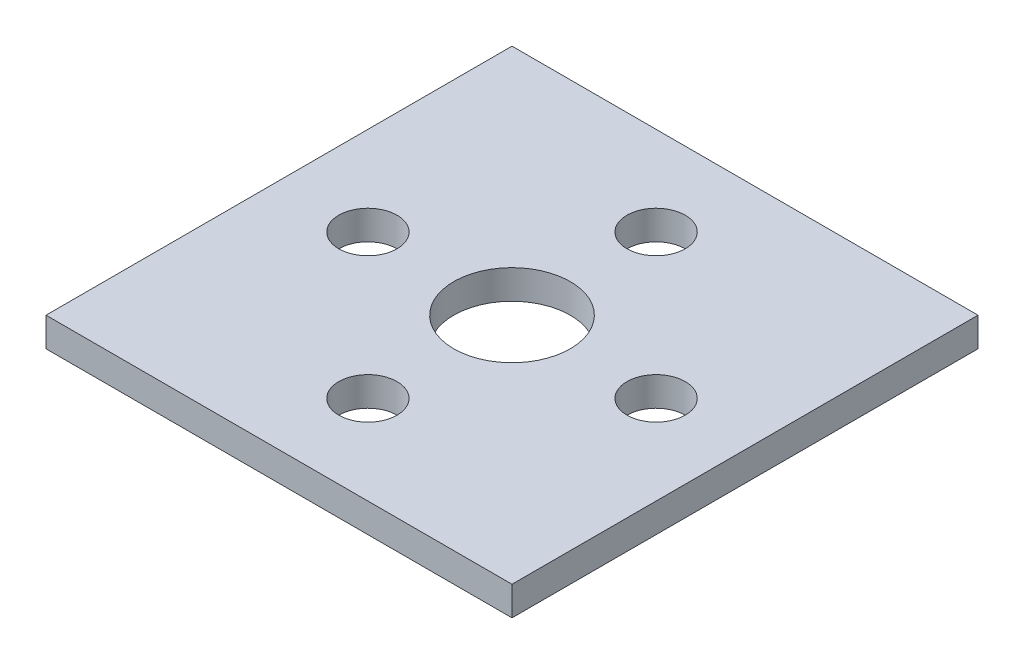
ISO-10303-21;
HEADER;
FILE_DESCRIPTION(('STEP AP214'),'2;1');
FILE_NAME('part.step','',(''),(''),'','','');
FILE_SCHEMA(('AUTOMOTIVE_DESIGN { 1 0 10303 214 1 1 1 1 }'));
ENDSEC;
DATA;
#1=APPLICATION_CONTEXT('core data for automotive mechanical design processes');
#2=APPLICATION_PROTOCOL_DEFINITION('international standard','automotive_design',2000,#1);
#3=PRODUCT_CONTEXT('',#1,'mechanical');
#4=PRODUCT('Part','Part','',(#3));
#5=PRODUCT_RELATED_PRODUCT_CATEGORY('part','',(#4));
#6=PRODUCT_DEFINITION_FORMATION('','',#4);
#7=PRODUCT_DEFINITION_CONTEXT('part definition',#1,'design');
#8=PRODUCT_DEFINITION('design','',#6,#7);
#9=PRODUCT_DEFINITION_SHAPE('','',#8);
#10=(LENGTH_UNIT() NAMED_UNIT(*) SI_UNIT(.MILLI.,.METRE.));
#11=(NAMED_UNIT(*) PLANE_ANGLE_UNIT() SI_UNIT($,.RADIAN.));
#12=(NAMED_UNIT(*) SI_UNIT($,.STERADIAN.) SOLID_ANGLE_UNIT());
#13=UNCERTAINTY_MEASURE_WITH_UNIT(LENGTH_MEASURE(1.E-05),#10,'distance_accuracy_value','');
#14=(GEOMETRIC_REPRESENTATION_CONTEXT(3) GLOBAL_UNCERTAINTY_ASSIGNED_CONTEXT((#13)) GLOBAL_UNIT_ASSIGNED_CONTEXT((#10,
#11,#12)) REPRESENTATION_CONTEXT('',''));
#15=CARTESIAN_POINT('',(0.,0.,0.));
#16=DIRECTION('',(0.,0.,1.));
#17=DIRECTION('',(1.,0.,0.));
#18=AXIS2_PLACEMENT_3D('',#15,#16,#17);
#19=CARTESIAN_POINT('',(0.,3.175,0.));
#20=DIRECTION('',(0.,-1.,0.));
#21=DIRECTION('',(0.,0.,-1.));
#22=AXIS2_PLACEMENT_3D('',#19,#20,#21);
#23=PLANE('',#22);
#24=DIRECTION('',(0.,0.,1.));
#25=VECTOR('',#24,1.);
#26=CARTESIAN_POINT('',(0.,3.175,0.));
#27=LINE('',#26,#25);
#28=CARTESIAN_POINT('',(0.,3.175,-50.8));
#29=VERTEX_POINT('',#28);
#30=CARTESIAN_POINT('',(0.,3.175,0.));
#31=VERTEX_POINT('',#30);
#32=EDGE_CURVE('E85',#29,#31,#27,.T.);
#33=ORIENTED_EDGE('',*,*,#32,.T.);
#34=DIRECTION('',(1.,0.,0.));
#35=VECTOR('',#34,1.);
#36=CARTESIAN_POINT('',(0.,3.175,0.));
#37=LINE('',#36,#35);
#38=CARTESIAN_POINT('',(50.8,3.175,0.));
#39=VERTEX_POINT('',#38);
#40=EDGE_CURVE('E80',#31,#39,#37,.T.);
#41=ORIENTED_EDGE('',*,*,#40,.T.);
#42=DIRECTION('',(0.,0.,-1.));
#43=VECTOR('',#42,1.);
#44=CARTESIAN_POINT('',(50.8,3.175,0.));
#45=LINE('',#44,#43);
#46=CARTESIAN_POINT('',(50.8,3.175,-50.8));
#47=VERTEX_POINT('',#46);
#48=EDGE_CURVE('E83',#39,#47,#45,.T.);
#49=ORIENTED_EDGE('',*,*,#48,.T.);
#50=DIRECTION('',(-1.,0.,0.));
#51=VECTOR('',#50,1.);
#52=CARTESIAN_POINT('',(0.,3.175,-50.8));
#53=LINE('',#52,#51);
#54=EDGE_CURVE('E50',#47,#29,#53,.T.);
#55=ORIENTED_EDGE('',*,*,#54,.T.);
#56=EDGE_LOOP('',(#33,#41,#49,#55));
#57=FACE_BOUND('',#56,.T.);
#58=CARTESIAN_POINT('',(25.4,3.175,-25.4));
#59=DIRECTION('',(0.,1.,0.));
#60=DIRECTION('',(0.,0.,1.));
#61=AXIS2_PLACEMENT_3D('',#58,#59,#60);
#62=CIRCLE('',#61,6.35);
#63=CARTESIAN_POINT('',(25.4,3.175,-19.05));
#64=VERTEX_POINT('',#63);
#65=EDGE_CURVE('E100',#64,#64,#62,.T.);
#66=ORIENTED_EDGE('',*,*,#65,.F.);
#67=EDGE_LOOP('',(#66));
#68=FACE_BOUND('',#67,.T.);
#69=CARTESIAN_POINT('',(25.4,3.175,-41.1092369477912));
#70=DIRECTION('',(0.,1.,0.));
#71=DIRECTION('',(0.,0.,1.));
#72=AXIS2_PLACEMENT_3D('',#69,#70,#71);
#73=CIRCLE('',#72,3.175);
#74=CARTESIAN_POINT('',(25.4,3.175,-37.9342369477912));
#75=VERTEX_POINT('',#74);
#76=EDGE_CURVE('E115',#75,#75,#73,.T.);
#77=ORIENTED_EDGE('',*,*,#76,.F.);
#78=EDGE_LOOP('',(#77));
#79=FACE_BOUND('',#78,.T.);
#80=CARTESIAN_POINT('',(41.1092369477914,3.175,-25.4000000000002));
#81=DIRECTION('',(0.,1.,0.));
#82=DIRECTION('',(0.,0.,1.));
#83=AXIS2_PLACEMENT_3D('',#80,#81,#82);
#84=CIRCLE('',#83,3.175);
#85=CARTESIAN_POINT('',(41.1092369477914,3.175,-22.2250000000002));
#86=VERTEX_POINT('',#85);
#87=EDGE_CURVE('E121',#86,#86,#84,.T.);
#88=ORIENTED_EDGE('',*,*,#87,.F.);
#89=EDGE_LOOP('',(#88));
#90=FACE_BOUND('',#89,.T.);
#91=CARTESIAN_POINT('',(25.4000000000003,3.175,-9.69076305220883));
#92=DIRECTION('',(0.,1.,0.));
#93=DIRECTION('',(0.,0.,1.));
#94=AXIS2_PLACEMENT_3D('',#91,#92,#93);
#95=CIRCLE('',#94,3.175);
#96=CARTESIAN_POINT('',(25.4000000000003,3.175,-6.51576305220883));
#97=VERTEX_POINT('',#96);
#98=EDGE_CURVE('E127',#97,#97,#95,.T.);
#99=ORIENTED_EDGE('',*,*,#98,.F.);
#100=EDGE_LOOP('',(#99));
#101=FACE_BOUND('',#100,.T.);
#102=CARTESIAN_POINT('',(9.69076305220906,3.175,-25.3999999999999));
#103=DIRECTION('',(0.,1.,0.));
#104=DIRECTION('',(0.,0.,1.));
#105=AXIS2_PLACEMENT_3D('',#102,#103,#104);
#106=CIRCLE('',#105,3.175);
#107=CARTESIAN_POINT('',(9.69076305220906,3.175,-22.2249999999999));
#108=VERTEX_POINT('',#107);
#109=EDGE_CURVE('E133',#108,#108,#106,.T.);
#110=ORIENTED_EDGE('',*,*,#109,.F.);
#111=EDGE_LOOP('',(#110));
#112=FACE_BOUND('',#111,.T.);
#113=ADVANCED_FACE('F33',(#57,#68,#79,#90,#101,#112),#23,.F.);
#114=CARTESIAN_POINT('',(0.,0.,0.));
#115=DIRECTION('',(0.,-1.,0.));
#116=DIRECTION('',(0.,0.,-1.));
#117=AXIS2_PLACEMENT_3D('',#114,#115,#116);
#118=PLANE('',#117);
#119=CARTESIAN_POINT('',(25.4000000000003,0.,-9.69076305220883));
#120=DIRECTION('',(0.,1.,0.));
#121=DIRECTION('',(0.,0.,1.));
#122=AXIS2_PLACEMENT_3D('',#119,#120,#121);
#123=CIRCLE('',#122,3.175);
#124=CARTESIAN_POINT('',(25.4000000000003,0.,-6.51576305220883));
#125=VERTEX_POINT('',#124);
#126=EDGE_CURVE('E130',#125,#125,#123,.T.);
#127=ORIENTED_EDGE('',*,*,#126,.T.);
#128=EDGE_LOOP('',(#127));
#129=FACE_BOUND('',#128,.T.);
#130=CARTESIAN_POINT('',(25.4,0.,-41.1092369477912));
#131=DIRECTION('',(0.,1.,0.));
#132=DIRECTION('',(0.,0.,1.));
#133=AXIS2_PLACEMENT_3D('',#130,#131,#132);
#134=CIRCLE('',#133,3.175);
#135=CARTESIAN_POINT('',(25.4,0.,-37.9342369477912));
#136=VERTEX_POINT('',#135);
#137=EDGE_CURVE('E118',#136,#136,#134,.T.);
#138=ORIENTED_EDGE('',*,*,#137,.T.);
#139=EDGE_LOOP('',(#138));
#140=FACE_BOUND('',#139,.T.);
#141=DIRECTION('',(0.,0.,1.));
#142=VECTOR('',#141,1.);
#143=CARTESIAN_POINT('',(0.,0.,0.));
#144=LINE('',#143,#142);
#145=CARTESIAN_POINT('',(0.,0.,-50.8));
#146=VERTEX_POINT('',#145);
#147=CARTESIAN_POINT('',(0.,0.,0.));
#148=VERTEX_POINT('',#147);
#149=EDGE_CURVE('E97',#146,#148,#144,.T.);
#150=ORIENTED_EDGE('',*,*,#149,.F.);
#151=DIRECTION('',(-1.,0.,0.));
#152=VECTOR('',#151,1.);
#153=CARTESIAN_POINT('',(0.,0.,-50.8));
#154=LINE('',#153,#152);
#155=CARTESIAN_POINT('',(50.8,0.,-50.8));
#156=VERTEX_POINT('',#155);
#157=EDGE_CURVE('E73',#156,#146,#154,.T.);
#158=ORIENTED_EDGE('',*,*,#157,.F.);
#159=DIRECTION('',(0.,0.,-1.));
#160=VECTOR('',#159,1.);
#161=CARTESIAN_POINT('',(50.8,0.,0.));
#162=LINE('',#161,#160);
#163=CARTESIAN_POINT('',(50.8,0.,0.));
#164=VERTEX_POINT('',#163);
#165=EDGE_CURVE('E67',#164,#156,#162,.T.);
#166=ORIENTED_EDGE('',*,*,#165,.F.);
#167=DIRECTION('',(1.,0.,0.));
#168=VECTOR('',#167,1.);
#169=CARTESIAN_POINT('',(0.,0.,0.));
#170=LINE('',#169,#168);
#171=EDGE_CURVE('E89',#148,#164,#170,.T.);
#172=ORIENTED_EDGE('',*,*,#171,.F.);
#173=EDGE_LOOP('',(#150,#158,#166,#172));
#174=FACE_BOUND('',#173,.T.);
#175=CARTESIAN_POINT('',(25.4,0.,-25.4));
#176=DIRECTION('',(0.,1.,0.));
#177=DIRECTION('',(0.,0.,1.));
#178=AXIS2_PLACEMENT_3D('',#175,#176,#177);
#179=CIRCLE('',#178,6.35);
#180=CARTESIAN_POINT('',(25.4,0.,-19.05));
#181=VERTEX_POINT('',#180);
#182=EDGE_CURVE('E112',#181,#181,#179,.T.);
#183=ORIENTED_EDGE('',*,*,#182,.T.);
#184=EDGE_LOOP('',(#183));
#185=FACE_BOUND('',#184,.T.);
#186=CARTESIAN_POINT('',(41.1092369477914,0.,-25.4000000000002));
#187=DIRECTION('',(0.,1.,0.));
#188=DIRECTION('',(0.,0.,1.));
#189=AXIS2_PLACEMENT_3D('',#186,#187,#188);
#190=CIRCLE('',#189,3.175);
#191=CARTESIAN_POINT('',(41.1092369477914,0.,-22.2250000000002));
#192=VERTEX_POINT('',#191);
#193=EDGE_CURVE('E124',#192,#192,#190,.T.);
#194=ORIENTED_EDGE('',*,*,#193,.T.);
#195=EDGE_LOOP('',(#194));
#196=FACE_BOUND('',#195,.T.);
#197=CARTESIAN_POINT('',(9.69076305220906,0.,-25.3999999999999));
#198=DIRECTION('',(0.,1.,0.));
#199=DIRECTION('',(0.,0.,1.));
#200=AXIS2_PLACEMENT_3D('',#197,#198,#199);
#201=CIRCLE('',#200,3.175);
#202=CARTESIAN_POINT('',(9.69076305220906,0.,-22.2249999999999));
#203=VERTEX_POINT('',#202);
#204=EDGE_CURVE('E136',#203,#203,#201,.T.);
#205=ORIENTED_EDGE('',*,*,#204,.T.);
#206=EDGE_LOOP('',(#205));
#207=FACE_BOUND('',#206,.T.);
#208=ADVANCED_FACE('F108',(#129,#140,#174,#185,#196,#207),#118,.T.);
#209=CARTESIAN_POINT('',(0.,3.175,0.));
#210=DIRECTION('',(1.,0.,0.));
#211=DIRECTION('',(0.,0.,-1.));
#212=AXIS2_PLACEMENT_3D('',#209,#210,#211);
#213=PLANE('',#212);
#214=ORIENTED_EDGE('',*,*,#149,.T.);
#215=DIRECTION('',(0.,-1.,0.));
#216=VECTOR('',#215,1.);
#217=CARTESIAN_POINT('',(0.,3.175,0.));
#218=LINE('',#217,#216);
#219=EDGE_CURVE('E11',#31,#148,#218,.T.);
#220=ORIENTED_EDGE('',*,*,#219,.F.);
#221=ORIENTED_EDGE('',*,*,#32,.F.);
#222=DIRECTION('',(0.,-1.,0.));
#223=VECTOR('',#222,1.);
#224=CARTESIAN_POINT('',(0.,3.175,-50.8));
#225=LINE('',#224,#223);
#226=EDGE_CURVE('E93',#29,#146,#225,.T.);
#227=ORIENTED_EDGE('',*,*,#226,.T.);
#228=EDGE_LOOP('',(#214,#220,#221,#227));
#229=FACE_BOUND('',#228,.T.);
#230=ADVANCED_FACE('F35',(#229),#213,.F.);
#231=CARTESIAN_POINT('',(0.,3.175,0.));
#232=DIRECTION('',(0.,0.,-1.));
#233=DIRECTION('',(-1.,0.,0.));
#234=AXIS2_PLACEMENT_3D('',#231,#232,#233);
#235=PLANE('',#234);
#236=ORIENTED_EDGE('',*,*,#171,.T.);
#237=DIRECTION('',(0.,-1.,0.));
#238=VECTOR('',#237,1.);
#239=CARTESIAN_POINT('',(50.8,3.175,0.));
#240=LINE('',#239,#238);
#241=EDGE_CURVE('E42',#39,#164,#240,.T.);
#242=ORIENTED_EDGE('',*,*,#241,.F.);
#243=ORIENTED_EDGE('',*,*,#40,.F.);
#244=ORIENTED_EDGE('',*,*,#219,.T.);
#245=EDGE_LOOP('',(#236,#242,#243,#244));
#246=FACE_BOUND('',#245,.T.);
#247=ADVANCED_FACE('F88',(#246),#235,.F.);
#248=CARTESIAN_POINT('',(50.8,3.175,0.));
#249=DIRECTION('',(-1.,0.,0.));
#250=DIRECTION('',(0.,0.,1.));
#251=AXIS2_PLACEMENT_3D('',#248,#249,#250);
#252=PLANE('',#251);
#253=ORIENTED_EDGE('',*,*,#165,.T.);
#254=DIRECTION('',(0.,-1.,0.));
#255=VECTOR('',#254,1.);
#256=CARTESIAN_POINT('',(50.8,3.175,-50.8));
#257=LINE('',#256,#255);
#258=EDGE_CURVE('E90',#47,#156,#257,.T.);
#259=ORIENTED_EDGE('',*,*,#258,.F.);
#260=ORIENTED_EDGE('',*,*,#48,.F.);
#261=ORIENTED_EDGE('',*,*,#241,.T.);
#262=EDGE_LOOP('',(#253,#259,#260,#261));
#263=FACE_BOUND('',#262,.T.);
#264=ADVANCED_FACE('F91',(#263),#252,.F.);
#265=CARTESIAN_POINT('',(0.,3.175,-50.8));
#266=DIRECTION('',(0.,0.,1.));
#267=DIRECTION('',(1.,0.,0.));
#268=AXIS2_PLACEMENT_3D('',#265,#266,#267);
#269=PLANE('',#268);
#270=ORIENTED_EDGE('',*,*,#157,.T.);
#271=ORIENTED_EDGE('',*,*,#226,.F.);
#272=ORIENTED_EDGE('',*,*,#54,.F.);
#273=ORIENTED_EDGE('',*,*,#258,.T.);
#274=EDGE_LOOP('',(#270,#271,#272,#273));
#275=FACE_BOUND('',#274,.T.);
#276=ADVANCED_FACE('F105',(#275),#269,.F.);
#277=CARTESIAN_POINT('',(25.4,3.175,-25.4));
#278=DIRECTION('',(0.,-1.,0.));
#279=DIRECTION('',(0.,0.,-1.));
#280=AXIS2_PLACEMENT_3D('',#277,#278,#279);
#281=CYLINDRICAL_SURFACE('',#280,6.35);
#282=ORIENTED_EDGE('',*,*,#65,.T.);
#283=EDGE_LOOP('',(#282));
#284=FACE_BOUND('',#283,.T.);
#285=ORIENTED_EDGE('',*,*,#182,.F.);
#286=EDGE_LOOP('',(#285));
#287=FACE_BOUND('',#286,.T.);
#288=ADVANCED_FACE('F153',(#284,#287),#281,.F.);
#289=CARTESIAN_POINT('',(25.4,3.175,-41.1092369477912));
#290=DIRECTION('',(0.,-1.,0.));
#291=DIRECTION('',(0.,0.,-1.));
#292=AXIS2_PLACEMENT_3D('',#289,#290,#291);
#293=CYLINDRICAL_SURFACE('',#292,3.175);
#294=ORIENTED_EDGE('',*,*,#76,.T.);
#295=EDGE_LOOP('',(#294));
#296=FACE_BOUND('',#295,.T.);
#297=ORIENTED_EDGE('',*,*,#137,.F.);
#298=EDGE_LOOP('',(#297));
#299=FACE_BOUND('',#298,.T.);
#300=ADVANCED_FACE('F199',(#296,#299),#293,.F.);
#301=CARTESIAN_POINT('',(41.1092369477914,3.175,-25.4000000000002));
#302=DIRECTION('',(0.,-1.,0.));
#303=DIRECTION('',(0.,0.,-1.));
#304=AXIS2_PLACEMENT_3D('',#301,#302,#303);
#305=CYLINDRICAL_SURFACE('',#304,3.175);
#306=ORIENTED_EDGE('',*,*,#87,.T.);
#307=EDGE_LOOP('',(#306));
#308=FACE_BOUND('',#307,.T.);
#309=ORIENTED_EDGE('',*,*,#193,.F.);
#310=EDGE_LOOP('',(#309));
#311=FACE_BOUND('',#310,.T.);
#312=ADVANCED_FACE('F207',(#308,#311),#305,.F.);
#313=CARTESIAN_POINT('',(25.4000000000003,3.175,-9.69076305220883));
#314=DIRECTION('',(0.,-1.,0.));
#315=DIRECTION('',(0.,0.,-1.));
#316=AXIS2_PLACEMENT_3D('',#313,#314,#315);
#317=CYLINDRICAL_SURFACE('',#316,3.175);
#318=ORIENTED_EDGE('',*,*,#98,.T.);
#319=EDGE_LOOP('',(#318));
#320=FACE_BOUND('',#319,.T.);
#321=ORIENTED_EDGE('',*,*,#126,.F.);
#322=EDGE_LOOP('',(#321));
#323=FACE_BOUND('',#322,.T.);
#324=ADVANCED_FACE('F215',(#320,#323),#317,.F.);
#325=CARTESIAN_POINT('',(9.69076305220906,3.175,-25.3999999999999));
#326=DIRECTION('',(0.,-1.,0.));
#327=DIRECTION('',(0.,0.,-1.));
#328=AXIS2_PLACEMENT_3D('',#325,#326,#327);
#329=CYLINDRICAL_SURFACE('',#328,3.175);
#330=ORIENTED_EDGE('',*,*,#109,.T.);
#331=EDGE_LOOP('',(#330));
#332=FACE_BOUND('',#331,.T.);
#333=ORIENTED_EDGE('',*,*,#204,.F.);
#334=EDGE_LOOP('',(#333));
#335=FACE_BOUND('',#334,.T.);
#336=ADVANCED_FACE('F142',(#332,#335),#329,.F.);
#337=CLOSED_SHELL('',(#113,#208,#230,#247,#264,#276,#288,#300,#312,#324,#336));
#338=MANIFOLD_SOLID_BREP('B2',#337);
#339=ADVANCED_BREP_SHAPE_REPRESENTATION('',(#18,#338),#14);
#340=SHAPE_DEFINITION_REPRESENTATION(#9,#339);
ENDSEC;
END-ISO-10303-21;
